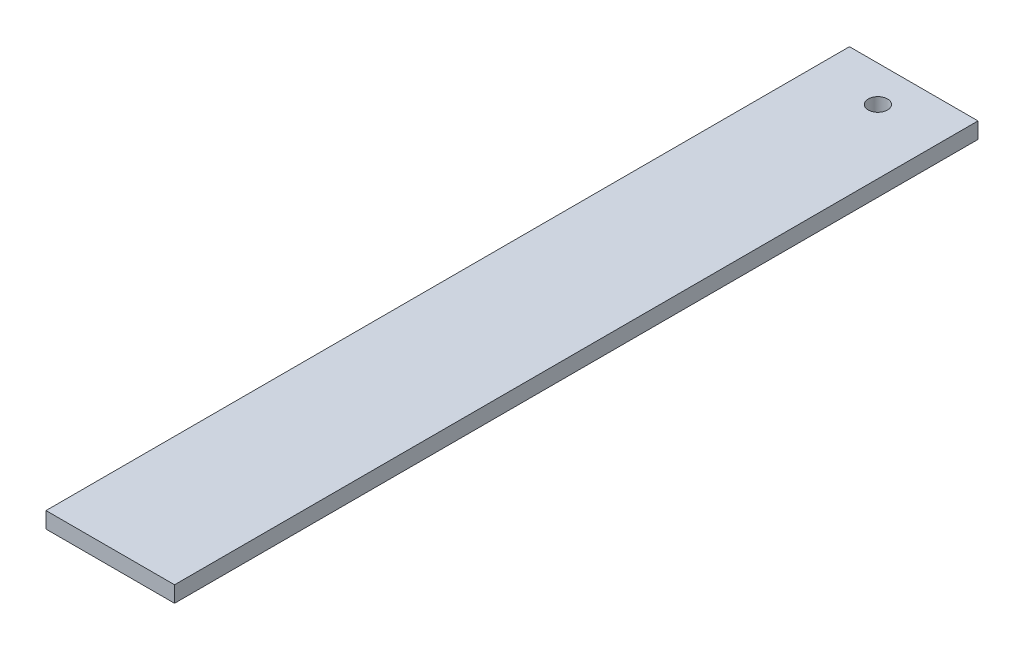
ISO-10303-21;
HEADER;
FILE_DESCRIPTION(('STEP AP214'),'2;1');
FILE_NAME('part.step','',(''),(''),'','','');
FILE_SCHEMA(('AUTOMOTIVE_DESIGN { 1 0 10303 214 1 1 1 1 }'));
ENDSEC;
DATA;
#1=APPLICATION_CONTEXT('core data for automotive mechanical design processes');
#2=APPLICATION_PROTOCOL_DEFINITION('international standard','automotive_design',2000,#1);
#3=PRODUCT_CONTEXT('',#1,'mechanical');
#4=PRODUCT('Part','Part','',(#3));
#5=PRODUCT_RELATED_PRODUCT_CATEGORY('part','',(#4));
#6=PRODUCT_DEFINITION_FORMATION('','',#4);
#7=PRODUCT_DEFINITION_CONTEXT('part definition',#1,'design');
#8=PRODUCT_DEFINITION('design','',#6,#7);
#9=PRODUCT_DEFINITION_SHAPE('','',#8);
#10=(LENGTH_UNIT() NAMED_UNIT(*) SI_UNIT(.MILLI.,.METRE.));
#11=(NAMED_UNIT(*) PLANE_ANGLE_UNIT() SI_UNIT($,.RADIAN.));
#12=(NAMED_UNIT(*) SI_UNIT($,.STERADIAN.) SOLID_ANGLE_UNIT());
#13=UNCERTAINTY_MEASURE_WITH_UNIT(LENGTH_MEASURE(1.E-05),#10,'distance_accuracy_value','');
#14=(GEOMETRIC_REPRESENTATION_CONTEXT(3) GLOBAL_UNCERTAINTY_ASSIGNED_CONTEXT((#13)) GLOBAL_UNIT_ASSIGNED_CONTEXT((#10,
#11,#12)) REPRESENTATION_CONTEXT('',''));
#15=CARTESIAN_POINT('',(0.,0.,0.));
#16=DIRECTION('',(0.,0.,1.));
#17=DIRECTION('',(1.,0.,0.));
#18=AXIS2_PLACEMENT_3D('',#15,#16,#17);
#19=CARTESIAN_POINT('',(0.,5.,0.));
#20=DIRECTION('',(0.,1.,0.));
#21=DIRECTION('',(0.,0.,1.));
#22=AXIS2_PLACEMENT_3D('',#19,#20,#21);
#23=PLANE('',#22);
#24=DIRECTION('',(0.,0.,1.));
#25=VECTOR('',#24,1.);
#26=CARTESIAN_POINT('',(0.,5.,0.));
#27=LINE('',#26,#25);
#28=CARTESIAN_POINT('',(0.,5.,0.));
#29=VERTEX_POINT('',#28);
#30=CARTESIAN_POINT('',(0.,5.,250.));
#31=VERTEX_POINT('',#30);
#32=EDGE_CURVE('E85',#29,#31,#27,.T.);
#33=ORIENTED_EDGE('',*,*,#32,.T.);
#34=DIRECTION('',(1.,0.,0.));
#35=VECTOR('',#34,1.);
#36=CARTESIAN_POINT('',(0.,5.,250.));
#37=LINE('',#36,#35);
#38=CARTESIAN_POINT('',(40.,5.,250.));
#39=VERTEX_POINT('',#38);
#40=EDGE_CURVE('E80',#31,#39,#37,.T.);
#41=ORIENTED_EDGE('',*,*,#40,.T.);
#42=DIRECTION('',(0.,0.,-1.));
#43=VECTOR('',#42,1.);
#44=CARTESIAN_POINT('',(40.,5.,0.));
#45=LINE('',#44,#43);
#46=CARTESIAN_POINT('',(40.,5.,0.));
#47=VERTEX_POINT('',#46);
#48=EDGE_CURVE('E83',#39,#47,#45,.T.);
#49=ORIENTED_EDGE('',*,*,#48,.T.);
#50=DIRECTION('',(-1.,0.,0.));
#51=VECTOR('',#50,1.);
#52=CARTESIAN_POINT('',(0.,5.,0.));
#53=LINE('',#52,#51);
#54=EDGE_CURVE('E50',#47,#29,#53,.T.);
#55=ORIENTED_EDGE('',*,*,#54,.T.);
#56=EDGE_LOOP('',(#33,#41,#49,#55));
#57=FACE_BOUND('',#56,.T.);
#58=CARTESIAN_POINT('',(20.,5.,11.1448738233642));
#59=DIRECTION('',(0.,1.,0.));
#60=DIRECTION('',(0.,0.,1.));
#61=AXIS2_PLACEMENT_3D('',#58,#59,#60);
#62=CIRCLE('',#61,2.99507400425738);
#63=CARTESIAN_POINT('',(20.,5.,14.1399478276216));
#64=VERTEX_POINT('',#63);
#65=EDGE_CURVE('E100',#64,#64,#62,.T.);
#66=ORIENTED_EDGE('',*,*,#65,.F.);
#67=EDGE_LOOP('',(#66));
#68=FACE_BOUND('',#67,.T.);
#69=ADVANCED_FACE('F33',(#57,#68),#23,.T.);
#70=CARTESIAN_POINT('',(0.,0.,0.));
#71=DIRECTION('',(0.,1.,0.));
#72=DIRECTION('',(0.,0.,1.));
#73=AXIS2_PLACEMENT_3D('',#70,#71,#72);
#74=PLANE('',#73);
#75=DIRECTION('',(0.,0.,1.));
#76=VECTOR('',#75,1.);
#77=CARTESIAN_POINT('',(0.,0.,0.));
#78=LINE('',#77,#76);
#79=CARTESIAN_POINT('',(0.,0.,0.));
#80=VERTEX_POINT('',#79);
#81=CARTESIAN_POINT('',(0.,0.,250.));
#82=VERTEX_POINT('',#81);
#83=EDGE_CURVE('E97',#80,#82,#78,.T.);
#84=ORIENTED_EDGE('',*,*,#83,.F.);
#85=DIRECTION('',(-1.,0.,0.));
#86=VECTOR('',#85,1.);
#87=CARTESIAN_POINT('',(0.,0.,0.));
#88=LINE('',#87,#86);
#89=CARTESIAN_POINT('',(40.,0.,0.));
#90=VERTEX_POINT('',#89);
#91=EDGE_CURVE('E73',#90,#80,#88,.T.);
#92=ORIENTED_EDGE('',*,*,#91,.F.);
#93=DIRECTION('',(0.,0.,-1.));
#94=VECTOR('',#93,1.);
#95=CARTESIAN_POINT('',(40.,0.,0.));
#96=LINE('',#95,#94);
#97=CARTESIAN_POINT('',(40.,0.,250.));
#98=VERTEX_POINT('',#97);
#99=EDGE_CURVE('E67',#98,#90,#96,.T.);
#100=ORIENTED_EDGE('',*,*,#99,.F.);
#101=DIRECTION('',(1.,0.,0.));
#102=VECTOR('',#101,1.);
#103=CARTESIAN_POINT('',(0.,0.,250.));
#104=LINE('',#103,#102);
#105=EDGE_CURVE('E89',#82,#98,#104,.T.);
#106=ORIENTED_EDGE('',*,*,#105,.F.);
#107=EDGE_LOOP('',(#84,#92,#100,#106));
#108=FACE_BOUND('',#107,.T.);
#109=CARTESIAN_POINT('',(20.,0.,11.1448738233642));
#110=DIRECTION('',(0.,1.,0.));
#111=DIRECTION('',(0.,0.,1.));
#112=AXIS2_PLACEMENT_3D('',#109,#110,#111);
#113=CIRCLE('',#112,2.99507400425738);
#114=CARTESIAN_POINT('',(20.,0.,14.1399478276216));
#115=VERTEX_POINT('',#114);
#116=EDGE_CURVE('E112',#115,#115,#113,.T.);
#117=ORIENTED_EDGE('',*,*,#116,.T.);
#118=EDGE_LOOP('',(#117));
#119=FACE_BOUND('',#118,.T.);
#120=ADVANCED_FACE('F108',(#108,#119),#74,.F.);
#121=CARTESIAN_POINT('',(0.,5.,0.));
#122=DIRECTION('',(1.,0.,0.));
#123=DIRECTION('',(0.,0.,-1.));
#124=AXIS2_PLACEMENT_3D('',#121,#122,#123);
#125=PLANE('',#124);
#126=ORIENTED_EDGE('',*,*,#83,.T.);
#127=DIRECTION('',(0.,-1.,0.));
#128=VECTOR('',#127,1.);
#129=CARTESIAN_POINT('',(0.,5.,250.));
#130=LINE('',#129,#128);
#131=EDGE_CURVE('E11',#31,#82,#130,.T.);
#132=ORIENTED_EDGE('',*,*,#131,.F.);
#133=ORIENTED_EDGE('',*,*,#32,.F.);
#134=DIRECTION('',(0.,-1.,0.));
#135=VECTOR('',#134,1.);
#136=CARTESIAN_POINT('',(0.,5.,0.));
#137=LINE('',#136,#135);
#138=EDGE_CURVE('E93',#29,#80,#137,.T.);
#139=ORIENTED_EDGE('',*,*,#138,.T.);
#140=EDGE_LOOP('',(#126,#132,#133,#139));
#141=FACE_BOUND('',#140,.T.);
#142=ADVANCED_FACE('F35',(#141),#125,.F.);
#143=CARTESIAN_POINT('',(0.,5.,250.));
#144=DIRECTION('',(0.,0.,-1.));
#145=DIRECTION('',(-1.,0.,0.));
#146=AXIS2_PLACEMENT_3D('',#143,#144,#145);
#147=PLANE('',#146);
#148=ORIENTED_EDGE('',*,*,#105,.T.);
#149=DIRECTION('',(0.,-1.,0.));
#150=VECTOR('',#149,1.);
#151=CARTESIAN_POINT('',(40.,5.,250.));
#152=LINE('',#151,#150);
#153=EDGE_CURVE('E42',#39,#98,#152,.T.);
#154=ORIENTED_EDGE('',*,*,#153,.F.);
#155=ORIENTED_EDGE('',*,*,#40,.F.);
#156=ORIENTED_EDGE('',*,*,#131,.T.);
#157=EDGE_LOOP('',(#148,#154,#155,#156));
#158=FACE_BOUND('',#157,.T.);
#159=ADVANCED_FACE('F88',(#158),#147,.F.);
#160=CARTESIAN_POINT('',(40.,5.,0.));
#161=DIRECTION('',(-1.,0.,0.));
#162=DIRECTION('',(0.,0.,1.));
#163=AXIS2_PLACEMENT_3D('',#160,#161,#162);
#164=PLANE('',#163);
#165=ORIENTED_EDGE('',*,*,#99,.T.);
#166=DIRECTION('',(0.,-1.,0.));
#167=VECTOR('',#166,1.);
#168=CARTESIAN_POINT('',(40.,5.,0.));
#169=LINE('',#168,#167);
#170=EDGE_CURVE('E90',#47,#90,#169,.T.);
#171=ORIENTED_EDGE('',*,*,#170,.F.);
#172=ORIENTED_EDGE('',*,*,#48,.F.);
#173=ORIENTED_EDGE('',*,*,#153,.T.);
#174=EDGE_LOOP('',(#165,#171,#172,#173));
#175=FACE_BOUND('',#174,.T.);
#176=ADVANCED_FACE('F91',(#175),#164,.F.);
#177=CARTESIAN_POINT('',(0.,5.,0.));
#178=DIRECTION('',(0.,0.,1.));
#179=DIRECTION('',(1.,0.,0.));
#180=AXIS2_PLACEMENT_3D('',#177,#178,#179);
#181=PLANE('',#180);
#182=ORIENTED_EDGE('',*,*,#91,.T.);
#183=ORIENTED_EDGE('',*,*,#138,.F.);
#184=ORIENTED_EDGE('',*,*,#54,.F.);
#185=ORIENTED_EDGE('',*,*,#170,.T.);
#186=EDGE_LOOP('',(#182,#183,#184,#185));
#187=FACE_BOUND('',#186,.T.);
#188=ADVANCED_FACE('F105',(#187),#181,.F.);
#189=CARTESIAN_POINT('',(20.,5.,11.1448738233642));
#190=DIRECTION('',(0.,-1.,0.));
#191=DIRECTION('',(0.,0.,-1.));
#192=AXIS2_PLACEMENT_3D('',#189,#190,#191);
#193=CYLINDRICAL_SURFACE('',#192,2.99507400425738);
#194=ORIENTED_EDGE('',*,*,#65,.T.);
#195=EDGE_LOOP('',(#194));
#196=FACE_BOUND('',#195,.T.);
#197=ORIENTED_EDGE('',*,*,#116,.F.);
#198=EDGE_LOOP('',(#197));
#199=FACE_BOUND('',#198,.T.);
#200=ADVANCED_FACE('F118',(#196,#199),#193,.F.);
#201=CLOSED_SHELL('',(#69,#120,#142,#159,#176,#188,#200));
#202=MANIFOLD_SOLID_BREP('B2',#201);
#203=ADVANCED_BREP_SHAPE_REPRESENTATION('',(#18,#202),#14);
#204=SHAPE_DEFINITION_REPRESENTATION(#9,#203);
ENDSEC;
END-ISO-10303-21;
